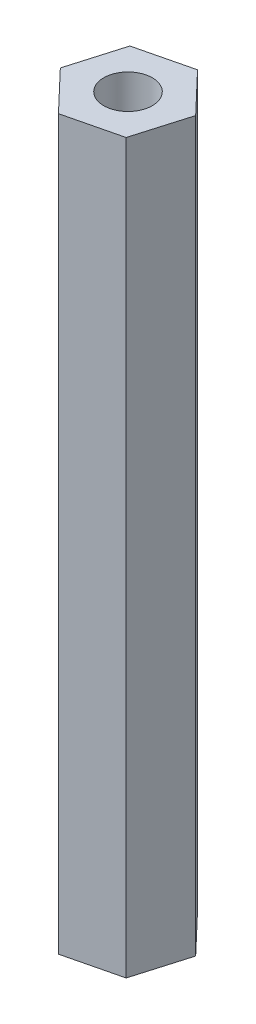
ISO-10303-21;
HEADER;
FILE_DESCRIPTION(('STEP AP214'),'2;1');
FILE_NAME('part.step','',(''),(''),'','','');
FILE_SCHEMA(('AUTOMOTIVE_DESIGN { 1 0 10303 214 1 1 1 1 }'));
ENDSEC;
DATA;
#1=APPLICATION_CONTEXT('core data for automotive mechanical design processes');
#2=APPLICATION_PROTOCOL_DEFINITION('international standard','automotive_design',2000,#1);
#3=PRODUCT_CONTEXT('',#1,'mechanical');
#4=PRODUCT('Part','Part','',(#3));
#5=PRODUCT_RELATED_PRODUCT_CATEGORY('part','',(#4));
#6=PRODUCT_DEFINITION_FORMATION('','',#4);
#7=PRODUCT_DEFINITION_CONTEXT('part definition',#1,'design');
#8=PRODUCT_DEFINITION('design','',#6,#7);
#9=PRODUCT_DEFINITION_SHAPE('','',#8);
#10=(LENGTH_UNIT() NAMED_UNIT(*) SI_UNIT(.MILLI.,.METRE.));
#11=(NAMED_UNIT(*) PLANE_ANGLE_UNIT() SI_UNIT($,.RADIAN.));
#12=(NAMED_UNIT(*) SI_UNIT($,.STERADIAN.) SOLID_ANGLE_UNIT());
#13=UNCERTAINTY_MEASURE_WITH_UNIT(LENGTH_MEASURE(1.E-05),#10,'distance_accuracy_value','');
#14=(GEOMETRIC_REPRESENTATION_CONTEXT(3) GLOBAL_UNCERTAINTY_ASSIGNED_CONTEXT((#13)) GLOBAL_UNIT_ASSIGNED_CONTEXT((#10,
#11,#12)) REPRESENTATION_CONTEXT('',''));
#15=CARTESIAN_POINT('',(0.,0.,0.));
#16=DIRECTION('',(0.,0.,1.));
#17=DIRECTION('',(1.,0.,0.));
#18=AXIS2_PLACEMENT_3D('',#15,#16,#17);
#19=CARTESIAN_POINT('',(0.,45.,0.));
#20=DIRECTION('',(0.,1.,0.));
#21=DIRECTION('',(0.,0.,1.));
#22=AXIS2_PLACEMENT_3D('',#19,#20,#21);
#23=PLANE('',#22);
#24=DIRECTION('',(0.971768575836565,0.,-0.235936082481199));
#25=VECTOR('',#24,1.);
#26=CARTESIAN_POINT('',(-0.975344299104183,45.,3.32395900970589));
#27=LINE('',#26,#25);
#28=CARTESIAN_POINT('',(-0.975344299104183,45.,3.32395900970589));
#29=VERTEX_POINT('',#28);
#30=CARTESIAN_POINT('',(2.39096079399137,45.,2.5066524453135));
#31=VERTEX_POINT('',#30);
#32=EDGE_CURVE('E131',#29,#31,#27,.T.);
#33=ORIENTED_EDGE('',*,*,#32,.T.);
#34=DIRECTION('',(0.281557646820184,0.,-0.959544314514489));
#35=VECTOR('',#34,1.);
#36=CARTESIAN_POINT('',(2.39096079399137,45.,2.5066524453135));
#37=LINE('',#36,#35);
#38=CARTESIAN_POINT('',(3.36630509309556,45.,-0.817306564392395));
#39=VERTEX_POINT('',#38);
#40=EDGE_CURVE('E89',#31,#39,#37,.T.);
#41=ORIENTED_EDGE('',*,*,#40,.T.);
#42=DIRECTION('',(-0.690210929016381,0.,-0.72360823203329));
#43=VECTOR('',#42,1.);
#44=CARTESIAN_POINT('',(3.36630509309556,45.,-0.817306564392395));
#45=LINE('',#44,#43);
#46=CARTESIAN_POINT('',(0.975344299104185,45.,-3.32395900970589));
#47=VERTEX_POINT('',#46);
#48=EDGE_CURVE('E102',#39,#47,#45,.T.);
#49=ORIENTED_EDGE('',*,*,#48,.T.);
#50=DIRECTION('',(-0.971768575836565,0.,0.235936082481198));
#51=VECTOR('',#50,1.);
#52=CARTESIAN_POINT('',(0.975344299104185,45.,-3.32395900970589));
#53=LINE('',#52,#51);
#54=CARTESIAN_POINT('',(-2.39096079399138,45.,-2.5066524453135));
#55=VERTEX_POINT('',#54);
#56=EDGE_CURVE('E96',#47,#55,#53,.T.);
#57=ORIENTED_EDGE('',*,*,#56,.T.);
#58=DIRECTION('',(-0.281557646820183,0.,0.959544314514489));
#59=VECTOR('',#58,1.);
#60=CARTESIAN_POINT('',(-2.39096079399138,45.,-2.5066524453135));
#61=LINE('',#60,#59);
#62=CARTESIAN_POINT('',(-3.36630509309556,45.,0.817306564392395));
#63=VERTEX_POINT('',#62);
#64=EDGE_CURVE('E100',#55,#63,#61,.T.);
#65=ORIENTED_EDGE('',*,*,#64,.T.);
#66=DIRECTION('',(0.690210929016381,0.,0.72360823203329));
#67=VECTOR('',#66,1.);
#68=CARTESIAN_POINT('',(-3.36630509309556,45.,0.817306564392395));
#69=LINE('',#68,#67);
#70=EDGE_CURVE('E52',#63,#29,#69,.T.);
#71=ORIENTED_EDGE('',*,*,#70,.T.);
#72=EDGE_LOOP('',(#33,#41,#49,#57,#65,#71));
#73=FACE_BOUND('',#72,.T.);
#74=CARTESIAN_POINT('',(0.,45.,0.));
#75=DIRECTION('',(0.,1.,0.));
#76=DIRECTION('',(0.,0.,1.));
#77=AXIS2_PLACEMENT_3D('',#74,#75,#76);
#78=CIRCLE('',#77,1.5);
#79=CARTESIAN_POINT('',(0.,45.,-1.5));
#80=VERTEX_POINT('',#79);
#81=EDGE_CURVE('E124',#80,#80,#78,.T.);
#82=ORIENTED_EDGE('',*,*,#81,.F.);
#83=EDGE_LOOP('',(#82));
#84=FACE_BOUND('',#83,.T.);
#85=ADVANCED_FACE('F35',(#73,#84),#23,.T.);
#86=CARTESIAN_POINT('',(0.,0.,0.));
#87=DIRECTION('',(0.,1.,0.));
#88=DIRECTION('',(0.,0.,1.));
#89=AXIS2_PLACEMENT_3D('',#86,#87,#88);
#90=PLANE('',#89);
#91=DIRECTION('',(0.971768575836565,0.,-0.235936082481199));
#92=VECTOR('',#91,1.);
#93=CARTESIAN_POINT('',(-0.975344299104183,0.,3.32395900970589));
#94=LINE('',#93,#92);
#95=CARTESIAN_POINT('',(-0.975344299104183,0.,3.32395900970589));
#96=VERTEX_POINT('',#95);
#97=CARTESIAN_POINT('',(2.39096079399137,0.,2.5066524453135));
#98=VERTEX_POINT('',#97);
#99=EDGE_CURVE('E120',#96,#98,#94,.T.);
#100=ORIENTED_EDGE('',*,*,#99,.F.);
#101=DIRECTION('',(0.690210929016381,0.,0.72360823203329));
#102=VECTOR('',#101,1.);
#103=CARTESIAN_POINT('',(-3.36630509309556,0.,0.817306564392395));
#104=LINE('',#103,#102);
#105=CARTESIAN_POINT('',(-3.36630509309556,0.,0.817306564392395));
#106=VERTEX_POINT('',#105);
#107=EDGE_CURVE('E81',#106,#96,#104,.T.);
#108=ORIENTED_EDGE('',*,*,#107,.F.);
#109=DIRECTION('',(-0.281557646820183,0.,0.959544314514489));
#110=VECTOR('',#109,1.);
#111=CARTESIAN_POINT('',(-2.39096079399138,0.,-2.5066524453135));
#112=LINE('',#111,#110);
#113=CARTESIAN_POINT('',(-2.39096079399138,0.,-2.5066524453135));
#114=VERTEX_POINT('',#113);
#115=EDGE_CURVE('E75',#114,#106,#112,.T.);
#116=ORIENTED_EDGE('',*,*,#115,.F.);
#117=DIRECTION('',(-0.971768575836565,0.,0.235936082481198));
#118=VECTOR('',#117,1.);
#119=CARTESIAN_POINT('',(0.975344299104185,0.,-3.32395900970589));
#120=LINE('',#119,#118);
#121=CARTESIAN_POINT('',(0.975344299104185,0.,-3.32395900970589));
#122=VERTEX_POINT('',#121);
#123=EDGE_CURVE('E110',#122,#114,#120,.T.);
#124=ORIENTED_EDGE('',*,*,#123,.F.);
#125=DIRECTION('',(-0.690210929016381,0.,-0.72360823203329));
#126=VECTOR('',#125,1.);
#127=CARTESIAN_POINT('',(3.36630509309556,0.,-0.817306564392395));
#128=LINE('',#127,#126);
#129=CARTESIAN_POINT('',(3.36630509309556,0.,-0.817306564392395));
#130=VERTEX_POINT('',#129);
#131=EDGE_CURVE('E126',#130,#122,#128,.T.);
#132=ORIENTED_EDGE('',*,*,#131,.F.);
#133=DIRECTION('',(0.281557646820184,0.,-0.959544314514489));
#134=VECTOR('',#133,1.);
#135=CARTESIAN_POINT('',(2.39096079399137,0.,2.5066524453135));
#136=LINE('',#135,#134);
#137=EDGE_CURVE('E123',#98,#130,#136,.T.);
#138=ORIENTED_EDGE('',*,*,#137,.F.);
#139=EDGE_LOOP('',(#100,#108,#116,#124,#132,#138));
#140=FACE_BOUND('',#139,.T.);
#141=CARTESIAN_POINT('',(0.,0.,0.));
#142=DIRECTION('',(0.,1.,0.));
#143=DIRECTION('',(0.,0.,1.));
#144=AXIS2_PLACEMENT_3D('',#141,#142,#143);
#145=CIRCLE('',#144,1.5);
#146=CARTESIAN_POINT('',(0.,0.,-1.5));
#147=VERTEX_POINT('',#146);
#148=EDGE_CURVE('E224',#147,#147,#145,.T.);
#149=ORIENTED_EDGE('',*,*,#148,.T.);
#150=EDGE_LOOP('',(#149));
#151=FACE_BOUND('',#150,.T.);
#152=ADVANCED_FACE('F140',(#140,#151),#90,.F.);
#153=CARTESIAN_POINT('',(-0.975344299104183,45.,3.32395900970589));
#154=DIRECTION('',(-0.235936082481199,0.,-0.971768575836565));
#155=DIRECTION('',(-0.971768575836565,0.,0.235936082481199));
#156=AXIS2_PLACEMENT_3D('',#153,#154,#155);
#157=PLANE('',#156);
#158=ORIENTED_EDGE('',*,*,#99,.T.);
#159=DIRECTION('',(0.,-1.,0.));
#160=VECTOR('',#159,1.);
#161=CARTESIAN_POINT('',(2.39096079399137,45.,2.5066524453135));
#162=LINE('',#161,#160);
#163=EDGE_CURVE('E11',#31,#98,#162,.T.);
#164=ORIENTED_EDGE('',*,*,#163,.F.);
#165=ORIENTED_EDGE('',*,*,#32,.F.);
#166=DIRECTION('',(0.,-1.,0.));
#167=VECTOR('',#166,1.);
#168=CARTESIAN_POINT('',(-0.975344299104183,45.,3.32395900970589));
#169=LINE('',#168,#167);
#170=EDGE_CURVE('E116',#29,#96,#169,.T.);
#171=ORIENTED_EDGE('',*,*,#170,.T.);
#172=EDGE_LOOP('',(#158,#164,#165,#171));
#173=FACE_BOUND('',#172,.T.);
#174=ADVANCED_FACE('F37',(#173),#157,.F.);
#175=CARTESIAN_POINT('',(2.39096079399137,45.,2.5066524453135));
#176=DIRECTION('',(-0.959544314514489,0.,-0.281557646820184));
#177=DIRECTION('',(-0.281557646820184,0.,0.959544314514489));
#178=AXIS2_PLACEMENT_3D('',#175,#176,#177);
#179=PLANE('',#178);
#180=ORIENTED_EDGE('',*,*,#137,.T.);
#181=DIRECTION('',(0.,-1.,0.));
#182=VECTOR('',#181,1.);
#183=CARTESIAN_POINT('',(3.36630509309556,45.,-0.817306564392395));
#184=LINE('',#183,#182);
#185=EDGE_CURVE('E44',#39,#130,#184,.T.);
#186=ORIENTED_EDGE('',*,*,#185,.F.);
#187=ORIENTED_EDGE('',*,*,#40,.F.);
#188=ORIENTED_EDGE('',*,*,#163,.T.);
#189=EDGE_LOOP('',(#180,#186,#187,#188));
#190=FACE_BOUND('',#189,.T.);
#191=ADVANCED_FACE('F165',(#190),#179,.F.);
#192=CARTESIAN_POINT('',(3.36630509309556,45.,-0.817306564392395));
#193=DIRECTION('',(-0.72360823203329,0.,0.690210929016381));
#194=DIRECTION('',(0.690210929016381,0.,0.72360823203329));
#195=AXIS2_PLACEMENT_3D('',#192,#193,#194);
#196=PLANE('',#195);
#197=ORIENTED_EDGE('',*,*,#131,.T.);
#198=DIRECTION('',(0.,-1.,0.));
#199=VECTOR('',#198,1.);
#200=CARTESIAN_POINT('',(0.975344299104185,45.,-3.32395900970589));
#201=LINE('',#200,#199);
#202=EDGE_CURVE('E111',#47,#122,#201,.T.);
#203=ORIENTED_EDGE('',*,*,#202,.F.);
#204=ORIENTED_EDGE('',*,*,#48,.F.);
#205=ORIENTED_EDGE('',*,*,#185,.T.);
#206=EDGE_LOOP('',(#197,#203,#204,#205));
#207=FACE_BOUND('',#206,.T.);
#208=ADVANCED_FACE('F137',(#207),#196,.F.);
#209=CARTESIAN_POINT('',(0.975344299104185,45.,-3.32395900970589));
#210=DIRECTION('',(0.235936082481198,0.,0.971768575836565));
#211=DIRECTION('',(0.971768575836565,0.,-0.235936082481198));
#212=AXIS2_PLACEMENT_3D('',#209,#210,#211);
#213=PLANE('',#212);
#214=ORIENTED_EDGE('',*,*,#123,.T.);
#215=DIRECTION('',(0.,-1.,0.));
#216=VECTOR('',#215,1.);
#217=CARTESIAN_POINT('',(-2.39096079399138,45.,-2.5066524453135));
#218=LINE('',#217,#216);
#219=EDGE_CURVE('E107',#55,#114,#218,.T.);
#220=ORIENTED_EDGE('',*,*,#219,.F.);
#221=ORIENTED_EDGE('',*,*,#56,.F.);
#222=ORIENTED_EDGE('',*,*,#202,.T.);
#223=EDGE_LOOP('',(#214,#220,#221,#222));
#224=FACE_BOUND('',#223,.T.);
#225=ADVANCED_FACE('F108',(#224),#213,.F.);
#226=CARTESIAN_POINT('',(-2.39096079399138,45.,-2.5066524453135));
#227=DIRECTION('',(0.959544314514489,0.,0.281557646820183));
#228=DIRECTION('',(0.281557646820183,0.,-0.959544314514489));
#229=AXIS2_PLACEMENT_3D('',#226,#227,#228);
#230=PLANE('',#229);
#231=ORIENTED_EDGE('',*,*,#115,.T.);
#232=DIRECTION('',(0.,-1.,0.));
#233=VECTOR('',#232,1.);
#234=CARTESIAN_POINT('',(-3.36630509309556,45.,0.817306564392395));
#235=LINE('',#234,#233);
#236=EDGE_CURVE('E112',#63,#106,#235,.T.);
#237=ORIENTED_EDGE('',*,*,#236,.F.);
#238=ORIENTED_EDGE('',*,*,#64,.F.);
#239=ORIENTED_EDGE('',*,*,#219,.T.);
#240=EDGE_LOOP('',(#231,#237,#238,#239));
#241=FACE_BOUND('',#240,.T.);
#242=ADVANCED_FACE('F114',(#241),#230,.F.);
#243=CARTESIAN_POINT('',(-3.36630509309556,45.,0.817306564392395));
#244=DIRECTION('',(0.723608232033291,0.,-0.690210929016381));
#245=DIRECTION('',(-0.690210929016381,0.,-0.723608232033291));
#246=AXIS2_PLACEMENT_3D('',#243,#244,#245);
#247=PLANE('',#246);
#248=ORIENTED_EDGE('',*,*,#107,.T.);
#249=ORIENTED_EDGE('',*,*,#170,.F.);
#250=ORIENTED_EDGE('',*,*,#70,.F.);
#251=ORIENTED_EDGE('',*,*,#236,.T.);
#252=EDGE_LOOP('',(#248,#249,#250,#251));
#253=FACE_BOUND('',#252,.T.);
#254=ADVANCED_FACE('F145',(#253),#247,.F.);
#255=CARTESIAN_POINT('',(0.,45.,0.));
#256=DIRECTION('',(0.,-1.,0.));
#257=DIRECTION('',(0.,0.,-1.));
#258=AXIS2_PLACEMENT_3D('',#255,#256,#257);
#259=CYLINDRICAL_SURFACE('',#258,1.5);
#260=CARTESIAN_POINT('',(0.,45.,-1.5));
#261=CARTESIAN_POINT('',(0.,44.53125,-1.5));
#262=CARTESIAN_POINT('',(0.,44.0625,-1.5));
#263=CARTESIAN_POINT('',(0.,43.125,-1.5));
#264=CARTESIAN_POINT('',(0.,42.65625,-1.5));
#265=CARTESIAN_POINT('',(0.,41.71875,-1.5));
#266=CARTESIAN_POINT('',(0.,41.25,-1.5));
#267=CARTESIAN_POINT('',(0.,40.3125,-1.5));
#268=CARTESIAN_POINT('',(0.,39.84375,-1.5));
#269=CARTESIAN_POINT('',(0.,38.90625,-1.5));
#270=CARTESIAN_POINT('',(0.,38.4375,-1.5));
#271=CARTESIAN_POINT('',(0.,37.5,-1.5));
#272=CARTESIAN_POINT('',(0.,37.03125,-1.5));
#273=CARTESIAN_POINT('',(0.,36.09375,-1.5));
#274=CARTESIAN_POINT('',(0.,35.625,-1.5));
#275=CARTESIAN_POINT('',(0.,34.6875,-1.5));
#276=CARTESIAN_POINT('',(0.,34.21875,-1.5));
#277=CARTESIAN_POINT('',(0.,33.28125,-1.5));
#278=CARTESIAN_POINT('',(0.,32.8125,-1.5));
#279=CARTESIAN_POINT('',(0.,31.875,-1.5));
#280=CARTESIAN_POINT('',(0.,31.40625,-1.5));
#281=CARTESIAN_POINT('',(0.,30.46875,-1.5));
#282=CARTESIAN_POINT('',(0.,30.,-1.5));
#283=CARTESIAN_POINT('',(0.,29.0625,-1.5));
#284=CARTESIAN_POINT('',(0.,28.59375,-1.5));
#285=CARTESIAN_POINT('',(0.,27.65625,-1.5));
#286=CARTESIAN_POINT('',(0.,27.1875,-1.5));
#287=CARTESIAN_POINT('',(0.,26.25,-1.5));
#288=CARTESIAN_POINT('',(0.,25.78125,-1.5));
#289=CARTESIAN_POINT('',(0.,24.84375,-1.5));
#290=CARTESIAN_POINT('',(0.,24.375,-1.5));
#291=CARTESIAN_POINT('',(0.,23.4375,-1.5));
#292=CARTESIAN_POINT('',(0.,22.96875,-1.5));
#293=CARTESIAN_POINT('',(0.,22.03125,-1.5));
#294=CARTESIAN_POINT('',(0.,21.5625,-1.5));
#295=CARTESIAN_POINT('',(0.,20.625,-1.5));
#296=CARTESIAN_POINT('',(0.,20.15625,-1.5));
#297=CARTESIAN_POINT('',(0.,19.21875,-1.5));
#298=CARTESIAN_POINT('',(0.,18.75,-1.5));
#299=CARTESIAN_POINT('',(0.,17.8125,-1.5));
#300=CARTESIAN_POINT('',(0.,17.34375,-1.5));
#301=CARTESIAN_POINT('',(0.,16.40625,-1.5));
#302=CARTESIAN_POINT('',(0.,15.9375,-1.5));
#303=CARTESIAN_POINT('',(0.,15.,-1.5));
#304=CARTESIAN_POINT('',(0.,14.53125,-1.5));
#305=CARTESIAN_POINT('',(0.,13.59375,-1.5));
#306=CARTESIAN_POINT('',(0.,13.125,-1.5));
#307=CARTESIAN_POINT('',(0.,12.1875,-1.5));
#308=CARTESIAN_POINT('',(0.,11.71875,-1.5));
#309=CARTESIAN_POINT('',(0.,10.78125,-1.5));
#310=CARTESIAN_POINT('',(0.,10.3125,-1.5));
#311=CARTESIAN_POINT('',(0.,9.37499999999999,-1.5));
#312=CARTESIAN_POINT('',(0.,8.90624999999999,-1.5));
#313=CARTESIAN_POINT('',(0.,7.96874999999999,-1.5));
#314=CARTESIAN_POINT('',(0.,7.5,-1.5));
#315=CARTESIAN_POINT('',(0.,6.56249999999999,-1.5));
#316=CARTESIAN_POINT('',(0.,6.09374999999999,-1.5));
#317=CARTESIAN_POINT('',(0.,5.15624999999999,-1.5));
#318=CARTESIAN_POINT('',(0.,4.68749999999999,-1.5));
#319=CARTESIAN_POINT('',(0.,3.74999999999999,-1.5));
#320=CARTESIAN_POINT('',(0.,3.28124999999999,-1.5));
#321=CARTESIAN_POINT('',(0.,2.34374999999999,-1.5));
#322=CARTESIAN_POINT('',(0.,1.87499999999999,-1.5));
#323=CARTESIAN_POINT('',(0.,0.937499999999992,-1.5));
#324=CARTESIAN_POINT('',(0.,0.468749999999993,-1.5));
#325=CARTESIAN_POINT('',(0.,0.,-1.5));
#326=B_SPLINE_CURVE_WITH_KNOTS('',3,(#260,#261,#262,#263,#264,#265,#266,#267,#268,#269,#270,
#271,#272,#273,#274,#275,#276,#277,#278,#279,#280,#281,#282,#283,#284,#285,#286,#287,#288,#289,
#290,#291,#292,#293,#294,#295,#296,#297,#298,#299,#300,#301,#302,#303,#304,#305,#306,#307,#308,
#309,#310,#311,#312,#313,#314,#315,#316,#317,#318,#319,#320,#321,#322,#323,#324,#325),
.UNSPECIFIED.,.F.,.F.,(4,2,2,2,2,2,2,2,2,2,2,2,2,2,2,2,2,2,2,2,2,2,2,2,2,2,2,2,2,2,2,2,4),(0.,
1.40625,2.8125,4.21874999999999,5.625,7.03125,8.43749999999999,9.84375,11.25,12.65625,14.0625,
15.46875,16.875,18.28125,19.6875,21.09375,22.5,23.90625,25.3125,26.71875,28.125,29.53125,
30.9375,32.34375,33.75,35.15625,36.5625,37.96875,39.375,40.78125,42.1875,43.59375,45.),.UNSPECIFIED.);
#327=EDGE_CURVE('BSEAM147',#80,#147,#326,.T.);
#328=ORIENTED_EDGE('',*,*,#81,.T.);
#329=ORIENTED_EDGE('',*,*,#148,.F.);
#330=ORIENTED_EDGE('',*,*,#327,.T.);
#331=ORIENTED_EDGE('',*,*,#327,.F.);
#332=EDGE_LOOP('',(#328,#330,#329,#331));
#333=FACE_BOUND('',#332,.T.);
#334=ADVANCED_FACE('F147',(#333),#259,.F.);
#335=CLOSED_SHELL('',(#85,#152,#174,#191,#208,#225,#242,#254,#334));
#336=MANIFOLD_SOLID_BREP('B2',#335);
#337=ADVANCED_BREP_SHAPE_REPRESENTATION('',(#18,#336),#14);
#338=SHAPE_DEFINITION_REPRESENTATION(#9,#337);
ENDSEC;
END-ISO-10303-21;
